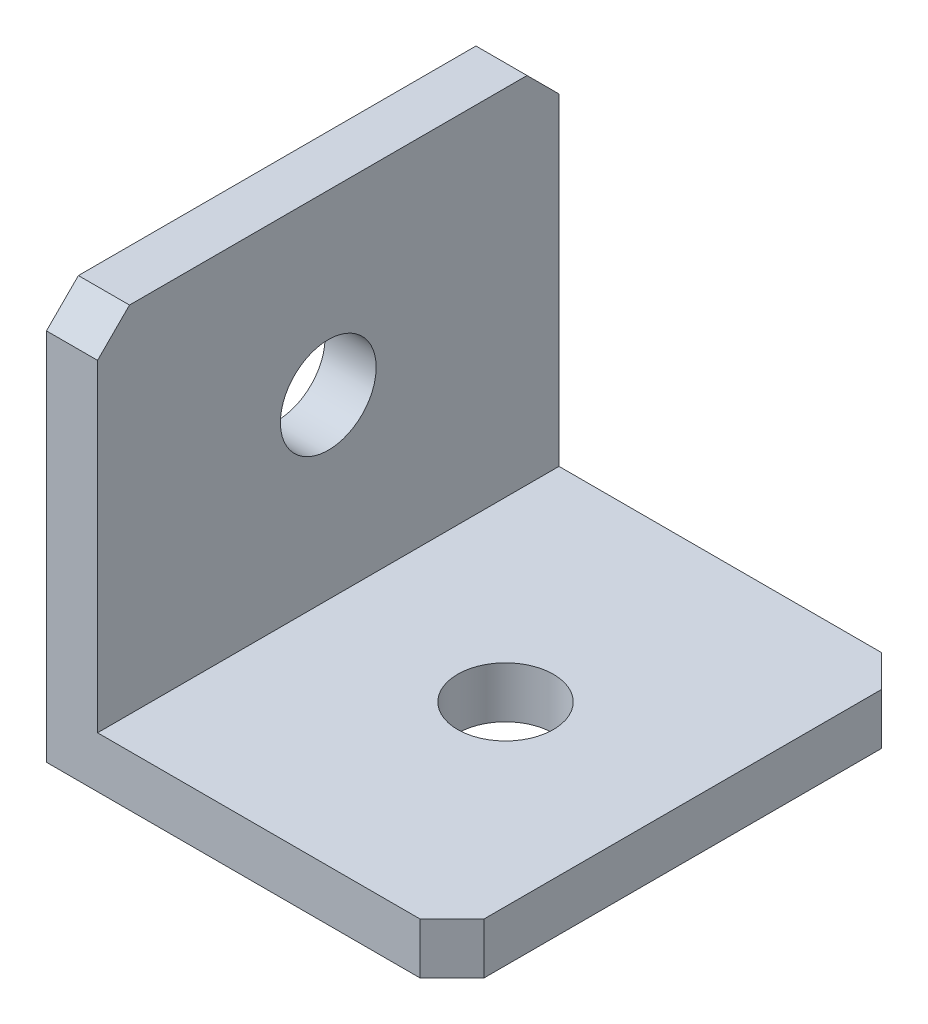
ISO-10303-21;
HEADER;
FILE_DESCRIPTION(('STEP AP214'),'2;1');
FILE_NAME('part.step','',(''),(''),'','','');
FILE_SCHEMA(('AUTOMOTIVE_DESIGN { 1 0 10303 214 1 1 1 1 }'));
ENDSEC;
DATA;
#1=APPLICATION_CONTEXT('core data for automotive mechanical design processes');
#2=APPLICATION_PROTOCOL_DEFINITION('international standard','automotive_design',2000,#1);
#3=PRODUCT_CONTEXT('',#1,'mechanical');
#4=PRODUCT('Part','Part','',(#3));
#5=PRODUCT_RELATED_PRODUCT_CATEGORY('part','',(#4));
#6=PRODUCT_DEFINITION_FORMATION('','',#4);
#7=PRODUCT_DEFINITION_CONTEXT('part definition',#1,'design');
#8=PRODUCT_DEFINITION('design','',#6,#7);
#9=PRODUCT_DEFINITION_SHAPE('','',#8);
#10=(LENGTH_UNIT() NAMED_UNIT(*) SI_UNIT(.MILLI.,.METRE.));
#11=(NAMED_UNIT(*) PLANE_ANGLE_UNIT() SI_UNIT($,.RADIAN.));
#12=(NAMED_UNIT(*) SI_UNIT($,.STERADIAN.) SOLID_ANGLE_UNIT());
#13=UNCERTAINTY_MEASURE_WITH_UNIT(LENGTH_MEASURE(1.E-05),#10,'distance_accuracy_value','');
#14=(GEOMETRIC_REPRESENTATION_CONTEXT(3) GLOBAL_UNCERTAINTY_ASSIGNED_CONTEXT((#13)) GLOBAL_UNIT_ASSIGNED_CONTEXT((#10,
#11,#12)) REPRESENTATION_CONTEXT('',''));
#15=CARTESIAN_POINT('',(0.,0.,0.));
#16=DIRECTION('',(0.,0.,1.));
#17=DIRECTION('',(1.,0.,0.));
#18=AXIS2_PLACEMENT_3D('',#15,#16,#17);
#19=CARTESIAN_POINT('',(22.2,0.,28.9));
#20=DIRECTION('',(0.,-1.,0.));
#21=DIRECTION('',(1.,0.,0.));
#22=AXIS2_PLACEMENT_3D('',#19,#20,#21);
#23=PLANE('',#22);
#24=CARTESIAN_POINT('',(11.1,0.,14.45));
#25=DIRECTION('',(0.,1.,0.));
#26=DIRECTION('',(-1.,0.,0.));
#27=AXIS2_PLACEMENT_3D('',#24,#25,#26);
#28=CIRCLE('',#27,3.);
#29=CARTESIAN_POINT('',(8.1,0.,14.45));
#30=VERTEX_POINT('',#29);
#31=EDGE_CURVE('E310',#30,#30,#28,.T.);
#32=ORIENTED_EDGE('',*,*,#31,.F.);
#33=EDGE_LOOP('',(#32));
#34=FACE_BOUND('',#33,.T.);
#35=DIRECTION('',(0.,0.,-1.));
#36=VECTOR('',#35,1.);
#37=CARTESIAN_POINT('',(22.2,0.,28.9));
#38=LINE('',#37,#36);
#39=CARTESIAN_POINT('',(22.2,0.,26.9));
#40=VERTEX_POINT('',#39);
#41=CARTESIAN_POINT('',(22.2,0.,1.99999999999999));
#42=VERTEX_POINT('',#41);
#43=EDGE_CURVE('E214',#40,#42,#38,.T.);
#44=ORIENTED_EDGE('',*,*,#43,.T.);
#45=DIRECTION('',(-0.70710678118655,0.,-0.707106781186545));
#46=VECTOR('',#45,1.);
#47=CARTESIAN_POINT('',(22.2,0.,1.99999999999999));
#48=LINE('',#47,#46);
#49=CARTESIAN_POINT('',(20.2,0.,0.));
#50=VERTEX_POINT('',#49);
#51=EDGE_CURVE('E201',#42,#50,#48,.T.);
#52=ORIENTED_EDGE('',*,*,#51,.T.);
#53=DIRECTION('',(-1.,0.,0.));
#54=VECTOR('',#53,1.);
#55=CARTESIAN_POINT('',(22.2,0.,0.));
#56=LINE('',#55,#54);
#57=CARTESIAN_POINT('',(0.,0.,0.));
#58=VERTEX_POINT('',#57);
#59=EDGE_CURVE('E152',#50,#58,#56,.T.);
#60=ORIENTED_EDGE('',*,*,#59,.T.);
#61=DIRECTION('',(0.,0.,-1.));
#62=VECTOR('',#61,1.);
#63=CARTESIAN_POINT('',(0.,0.,28.9));
#64=LINE('',#63,#62);
#65=CARTESIAN_POINT('',(0.,0.,28.9));
#66=VERTEX_POINT('',#65);
#67=EDGE_CURVE('E143',#66,#58,#64,.T.);
#68=ORIENTED_EDGE('',*,*,#67,.F.);
#69=DIRECTION('',(-1.,0.,0.));
#70=VECTOR('',#69,1.);
#71=CARTESIAN_POINT('',(22.2,0.,28.9));
#72=LINE('',#71,#70);
#73=CARTESIAN_POINT('',(20.2,0.,28.9));
#74=VERTEX_POINT('',#73);
#75=EDGE_CURVE('E125',#74,#66,#72,.T.);
#76=ORIENTED_EDGE('',*,*,#75,.F.);
#77=DIRECTION('',(-0.707106781186546,0.,0.707106781186549));
#78=VECTOR('',#77,1.);
#79=CARTESIAN_POINT('',(20.2,0.,28.9));
#80=LINE('',#79,#78);
#81=EDGE_CURVE('E198',#74,#40,#80,.F.);
#82=ORIENTED_EDGE('',*,*,#81,.T.);
#83=EDGE_LOOP('',(#44,#52,#60,#68,#76,#82));
#84=FACE_BOUND('',#83,.T.);
#85=ADVANCED_FACE('F45',(#34,#84),#23,.F.);
#86=CARTESIAN_POINT('',(0.,0.,28.9));
#87=DIRECTION('',(-1.,0.,0.));
#88=DIRECTION('',(0.,-1.,0.));
#89=AXIS2_PLACEMENT_3D('',#86,#87,#88);
#90=PLANE('',#89);
#91=CARTESIAN_POINT('',(0.,11.1,14.45));
#92=DIRECTION('',(1.,0.,0.));
#93=DIRECTION('',(0.,1.,0.));
#94=AXIS2_PLACEMENT_3D('',#91,#92,#93);
#95=CIRCLE('',#94,3.);
#96=CARTESIAN_POINT('',(0.,14.1,14.45));
#97=VERTEX_POINT('',#96);
#98=EDGE_CURVE('E306',#97,#97,#95,.T.);
#99=ORIENTED_EDGE('',*,*,#98,.F.);
#100=EDGE_LOOP('',(#99));
#101=FACE_BOUND('',#100,.T.);
#102=DIRECTION('',(0.,1.,0.));
#103=VECTOR('',#102,1.);
#104=CARTESIAN_POINT('',(0.,0.,0.));
#105=LINE('',#104,#103);
#106=CARTESIAN_POINT('',(0.,20.2,0.));
#107=VERTEX_POINT('',#106);
#108=EDGE_CURVE('E244',#58,#107,#105,.T.);
#109=ORIENTED_EDGE('',*,*,#108,.T.);
#110=DIRECTION('',(0.,0.70710678118655,0.707106781186545));
#111=VECTOR('',#110,1.);
#112=CARTESIAN_POINT('',(0.,22.2,1.99999999999999));
#113=LINE('',#112,#111);
#114=CARTESIAN_POINT('',(0.,22.2,1.99999999999999));
#115=VERTEX_POINT('',#114);
#116=EDGE_CURVE('E184',#107,#115,#113,.T.);
#117=ORIENTED_EDGE('',*,*,#116,.T.);
#118=DIRECTION('',(0.,0.,-1.));
#119=VECTOR('',#118,1.);
#120=CARTESIAN_POINT('',(0.,22.2,28.9));
#121=LINE('',#120,#119);
#122=CARTESIAN_POINT('',(0.,22.2,26.9));
#123=VERTEX_POINT('',#122);
#124=EDGE_CURVE('E156',#123,#115,#121,.T.);
#125=ORIENTED_EDGE('',*,*,#124,.F.);
#126=DIRECTION('',(0.,0.707106781186546,-0.707106781186549));
#127=VECTOR('',#126,1.);
#128=CARTESIAN_POINT('',(0.,20.2,28.9));
#129=LINE('',#128,#127);
#130=CARTESIAN_POINT('',(0.,20.2,28.9));
#131=VERTEX_POINT('',#130);
#132=EDGE_CURVE('E146',#123,#131,#129,.F.);
#133=ORIENTED_EDGE('',*,*,#132,.T.);
#134=DIRECTION('',(0.,1.,0.));
#135=VECTOR('',#134,1.);
#136=CARTESIAN_POINT('',(0.,0.,28.9));
#137=LINE('',#136,#135);
#138=EDGE_CURVE('E129',#66,#131,#137,.T.);
#139=ORIENTED_EDGE('',*,*,#138,.F.);
#140=ORIENTED_EDGE('',*,*,#67,.T.);
#141=EDGE_LOOP('',(#109,#117,#125,#133,#139,#140));
#142=FACE_BOUND('',#141,.T.);
#143=ADVANCED_FACE('F142',(#101,#142),#90,.F.);
#144=CARTESIAN_POINT('',(0.,22.2,28.9));
#145=DIRECTION('',(0.,-1.,0.));
#146=DIRECTION('',(0.,0.,-1.));
#147=AXIS2_PLACEMENT_3D('',#144,#145,#146);
#148=PLANE('',#147);
#149=ORIENTED_EDGE('',*,*,#124,.T.);
#150=DIRECTION('',(-1.,0.,0.));
#151=VECTOR('',#150,1.);
#152=CARTESIAN_POINT('',(-3.2,22.2,1.99999999999999));
#153=LINE('',#152,#151);
#154=CARTESIAN_POINT('',(-3.2,22.2,1.99999999999999));
#155=VERTEX_POINT('',#154);
#156=EDGE_CURVE('E160',#115,#155,#153,.T.);
#157=ORIENTED_EDGE('',*,*,#156,.T.);
#158=DIRECTION('',(0.,0.,-1.));
#159=VECTOR('',#158,1.);
#160=CARTESIAN_POINT('',(-3.2,22.2,28.9));
#161=LINE('',#160,#159);
#162=CARTESIAN_POINT('',(-3.2,22.2,26.9));
#163=VERTEX_POINT('',#162);
#164=EDGE_CURVE('E163',#163,#155,#161,.T.);
#165=ORIENTED_EDGE('',*,*,#164,.F.);
#166=DIRECTION('',(1.,0.,0.));
#167=VECTOR('',#166,1.);
#168=CARTESIAN_POINT('',(0.,22.2,26.9));
#169=LINE('',#168,#167);
#170=EDGE_CURVE('E155',#163,#123,#169,.T.);
#171=ORIENTED_EDGE('',*,*,#170,.T.);
#172=EDGE_LOOP('',(#149,#157,#165,#171));
#173=FACE_BOUND('',#172,.T.);
#174=ADVANCED_FACE('F235',(#173),#148,.F.);
#175=CARTESIAN_POINT('',(-3.2,22.2,28.9));
#176=DIRECTION('',(1.,0.,0.));
#177=DIRECTION('',(0.,1.,0.));
#178=AXIS2_PLACEMENT_3D('',#175,#176,#177);
#179=PLANE('',#178);
#180=CARTESIAN_POINT('',(-3.2,11.1,14.45));
#181=DIRECTION('',(1.,0.,0.));
#182=DIRECTION('',(0.,1.,0.));
#183=AXIS2_PLACEMENT_3D('',#180,#181,#182);
#184=CIRCLE('',#183,3.);
#185=CARTESIAN_POINT('',(-3.2,14.1,14.45));
#186=VERTEX_POINT('',#185);
#187=EDGE_CURVE('E303',#186,#186,#184,.T.);
#188=ORIENTED_EDGE('',*,*,#187,.T.);
#189=EDGE_LOOP('',(#188));
#190=FACE_BOUND('',#189,.T.);
#191=ORIENTED_EDGE('',*,*,#164,.T.);
#192=DIRECTION('',(0.,-0.70710678118655,-0.707106781186545));
#193=VECTOR('',#192,1.);
#194=CARTESIAN_POINT('',(-3.2,22.2,1.99999999999999));
#195=LINE('',#194,#193);
#196=CARTESIAN_POINT('',(-3.2,20.2,0.));
#197=VERTEX_POINT('',#196);
#198=EDGE_CURVE('E173',#155,#197,#195,.T.);
#199=ORIENTED_EDGE('',*,*,#198,.T.);
#200=DIRECTION('',(0.,-1.,0.));
#201=VECTOR('',#200,1.);
#202=CARTESIAN_POINT('',(-3.2,22.2,0.));
#203=LINE('',#202,#201);
#204=CARTESIAN_POINT('',(-3.2,-3.2,0.));
#205=VERTEX_POINT('',#204);
#206=EDGE_CURVE('E247',#197,#205,#203,.T.);
#207=ORIENTED_EDGE('',*,*,#206,.T.);
#208=DIRECTION('',(0.,0.,-1.));
#209=VECTOR('',#208,1.);
#210=CARTESIAN_POINT('',(-3.2,-3.2,28.9));
#211=LINE('',#210,#209);
#212=CARTESIAN_POINT('',(-3.2,-3.2,28.9));
#213=VERTEX_POINT('',#212);
#214=EDGE_CURVE('E221',#213,#205,#211,.T.);
#215=ORIENTED_EDGE('',*,*,#214,.F.);
#216=DIRECTION('',(0.,-1.,0.));
#217=VECTOR('',#216,1.);
#218=CARTESIAN_POINT('',(-3.2,22.2,28.9));
#219=LINE('',#218,#217);
#220=CARTESIAN_POINT('',(-3.2,20.2,28.9));
#221=VERTEX_POINT('',#220);
#222=EDGE_CURVE('E148',#221,#213,#219,.T.);
#223=ORIENTED_EDGE('',*,*,#222,.F.);
#224=DIRECTION('',(0.,-0.707106781186546,0.707106781186549));
#225=VECTOR('',#224,1.);
#226=CARTESIAN_POINT('',(-3.2,20.2,28.9));
#227=LINE('',#226,#225);
#228=EDGE_CURVE('E170',#221,#163,#227,.F.);
#229=ORIENTED_EDGE('',*,*,#228,.T.);
#230=EDGE_LOOP('',(#191,#199,#207,#215,#223,#229));
#231=FACE_BOUND('',#230,.T.);
#232=ADVANCED_FACE('F231',(#190,#231),#179,.F.);
#233=CARTESIAN_POINT('',(-3.2,-3.2,28.9));
#234=DIRECTION('',(0.,1.,0.));
#235=DIRECTION('',(-1.,0.,0.));
#236=AXIS2_PLACEMENT_3D('',#233,#234,#235);
#237=PLANE('',#236);
#238=CARTESIAN_POINT('',(11.1,-3.2,14.45));
#239=DIRECTION('',(0.,1.,0.));
#240=DIRECTION('',(-1.,0.,0.));
#241=AXIS2_PLACEMENT_3D('',#238,#239,#240);
#242=CIRCLE('',#241,3.);
#243=CARTESIAN_POINT('',(8.1,-3.2,14.45));
#244=VERTEX_POINT('',#243);
#245=EDGE_CURVE('E245',#244,#244,#242,.T.);
#246=ORIENTED_EDGE('',*,*,#245,.T.);
#247=EDGE_LOOP('',(#246));
#248=FACE_BOUND('',#247,.T.);
#249=DIRECTION('',(1.,0.,0.));
#250=VECTOR('',#249,1.);
#251=CARTESIAN_POINT('',(-3.2,-3.2,0.));
#252=LINE('',#251,#250);
#253=CARTESIAN_POINT('',(20.2,-3.2,0.));
#254=VERTEX_POINT('',#253);
#255=EDGE_CURVE('E137',#205,#254,#252,.T.);
#256=ORIENTED_EDGE('',*,*,#255,.T.);
#257=DIRECTION('',(0.70710678118655,0.,0.707106781186545));
#258=VECTOR('',#257,1.);
#259=CARTESIAN_POINT('',(22.2,-3.2,1.99999999999999));
#260=LINE('',#259,#258);
#261=CARTESIAN_POINT('',(22.2,-3.2,1.99999999999999));
#262=VERTEX_POINT('',#261);
#263=EDGE_CURVE('E11',#254,#262,#260,.T.);
#264=ORIENTED_EDGE('',*,*,#263,.T.);
#265=DIRECTION('',(0.,0.,-1.));
#266=VECTOR('',#265,1.);
#267=CARTESIAN_POINT('',(22.2,-3.2,28.9));
#268=LINE('',#267,#266);
#269=CARTESIAN_POINT('',(22.2,-3.2,26.9));
#270=VERTEX_POINT('',#269);
#271=EDGE_CURVE('E209',#270,#262,#268,.T.);
#272=ORIENTED_EDGE('',*,*,#271,.F.);
#273=DIRECTION('',(0.707106781186546,0.,-0.707106781186549));
#274=VECTOR('',#273,1.);
#275=CARTESIAN_POINT('',(20.2,-3.2,28.9));
#276=LINE('',#275,#274);
#277=CARTESIAN_POINT('',(20.2,-3.2,28.9));
#278=VERTEX_POINT('',#277);
#279=EDGE_CURVE('E55',#270,#278,#276,.F.);
#280=ORIENTED_EDGE('',*,*,#279,.T.);
#281=DIRECTION('',(1.,0.,0.));
#282=VECTOR('',#281,1.);
#283=CARTESIAN_POINT('',(-3.2,-3.2,28.9));
#284=LINE('',#283,#282);
#285=EDGE_CURVE('E208',#213,#278,#284,.T.);
#286=ORIENTED_EDGE('',*,*,#285,.F.);
#287=ORIENTED_EDGE('',*,*,#214,.T.);
#288=EDGE_LOOP('',(#256,#264,#272,#280,#286,#287));
#289=FACE_BOUND('',#288,.T.);
#290=ADVANCED_FACE('F206',(#248,#289),#237,.F.);
#291=CARTESIAN_POINT('',(22.2,-3.2,28.9));
#292=DIRECTION('',(-1.,0.,0.));
#293=DIRECTION('',(0.,0.,1.));
#294=AXIS2_PLACEMENT_3D('',#291,#292,#293);
#295=PLANE('',#294);
#296=ORIENTED_EDGE('',*,*,#271,.T.);
#297=DIRECTION('',(0.,1.,0.));
#298=VECTOR('',#297,1.);
#299=CARTESIAN_POINT('',(22.2,0.,1.99999999999999));
#300=LINE('',#299,#298);
#301=EDGE_CURVE('E194',#262,#42,#300,.T.);
#302=ORIENTED_EDGE('',*,*,#301,.T.);
#303=ORIENTED_EDGE('',*,*,#43,.F.);
#304=DIRECTION('',(0.,-1.,0.));
#305=VECTOR('',#304,1.);
#306=CARTESIAN_POINT('',(22.2,-3.2,26.9));
#307=LINE('',#306,#305);
#308=EDGE_CURVE('E67',#40,#270,#307,.T.);
#309=ORIENTED_EDGE('',*,*,#308,.T.);
#310=EDGE_LOOP('',(#296,#302,#303,#309));
#311=FACE_BOUND('',#310,.T.);
#312=ADVANCED_FACE('F216',(#311),#295,.F.);
#313=CARTESIAN_POINT('',(0.,0.,28.9));
#314=DIRECTION('',(0.,0.,-1.));
#315=DIRECTION('',(-1.,0.,0.));
#316=AXIS2_PLACEMENT_3D('',#313,#314,#315);
#317=PLANE('',#316);
#318=ORIENTED_EDGE('',*,*,#138,.T.);
#319=DIRECTION('',(-1.,0.,0.));
#320=VECTOR('',#319,1.);
#321=CARTESIAN_POINT('',(0.,20.2,28.9));
#322=LINE('',#321,#320);
#323=EDGE_CURVE('E189',#131,#221,#322,.T.);
#324=ORIENTED_EDGE('',*,*,#323,.T.);
#325=ORIENTED_EDGE('',*,*,#222,.T.);
#326=ORIENTED_EDGE('',*,*,#285,.T.);
#327=DIRECTION('',(0.,1.,0.));
#328=VECTOR('',#327,1.);
#329=CARTESIAN_POINT('',(20.2,0.,28.9));
#330=LINE('',#329,#328);
#331=EDGE_CURVE('E133',#278,#74,#330,.T.);
#332=ORIENTED_EDGE('',*,*,#331,.T.);
#333=ORIENTED_EDGE('',*,*,#75,.T.);
#334=EDGE_LOOP('',(#318,#324,#325,#326,#332,#333));
#335=FACE_BOUND('',#334,.T.);
#336=ADVANCED_FACE('F127',(#335),#317,.F.);
#337=CARTESIAN_POINT('',(0.,0.,0.));
#338=DIRECTION('',(0.,0.,-1.));
#339=DIRECTION('',(-1.,0.,0.));
#340=AXIS2_PLACEMENT_3D('',#337,#338,#339);
#341=PLANE('',#340);
#342=ORIENTED_EDGE('',*,*,#206,.F.);
#343=DIRECTION('',(1.,0.,0.));
#344=VECTOR('',#343,1.);
#345=CARTESIAN_POINT('',(0.,20.2,0.));
#346=LINE('',#345,#344);
#347=EDGE_CURVE('E179',#197,#107,#346,.T.);
#348=ORIENTED_EDGE('',*,*,#347,.T.);
#349=ORIENTED_EDGE('',*,*,#108,.F.);
#350=ORIENTED_EDGE('',*,*,#59,.F.);
#351=DIRECTION('',(0.,-1.,0.));
#352=VECTOR('',#351,1.);
#353=CARTESIAN_POINT('',(20.2,-3.2,0.));
#354=LINE('',#353,#352);
#355=EDGE_CURVE('E176',#50,#254,#354,.T.);
#356=ORIENTED_EDGE('',*,*,#355,.T.);
#357=ORIENTED_EDGE('',*,*,#255,.F.);
#358=EDGE_LOOP('',(#342,#348,#349,#350,#356,#357));
#359=FACE_BOUND('',#358,.T.);
#360=ADVANCED_FACE('F255',(#359),#341,.T.);
#361=CARTESIAN_POINT('',(0.,22.2,1.99999999999999));
#362=DIRECTION('',(0.,0.707106781186545,-0.70710678118655));
#363=DIRECTION('',(1.,0.,0.));
#364=AXIS2_PLACEMENT_3D('',#361,#362,#363);
#365=PLANE('',#364);
#366=ORIENTED_EDGE('',*,*,#116,.F.);
#367=ORIENTED_EDGE('',*,*,#347,.F.);
#368=ORIENTED_EDGE('',*,*,#198,.F.);
#369=ORIENTED_EDGE('',*,*,#156,.F.);
#370=EDGE_LOOP('',(#366,#367,#368,#369));
#371=FACE_BOUND('',#370,.T.);
#372=ADVANCED_FACE('F259',(#371),#365,.T.);
#373=CARTESIAN_POINT('',(0.,20.2,28.9));
#374=DIRECTION('',(0.,-0.707106781186549,-0.707106781186546));
#375=DIRECTION('',(-1.,0.,0.));
#376=AXIS2_PLACEMENT_3D('',#373,#374,#375);
#377=PLANE('',#376);
#378=ORIENTED_EDGE('',*,*,#132,.F.);
#379=ORIENTED_EDGE('',*,*,#170,.F.);
#380=ORIENTED_EDGE('',*,*,#228,.F.);
#381=ORIENTED_EDGE('',*,*,#323,.F.);
#382=EDGE_LOOP('',(#378,#379,#380,#381));
#383=FACE_BOUND('',#382,.T.);
#384=ADVANCED_FACE('F238',(#383),#377,.F.);
#385=CARTESIAN_POINT('',(22.2,-3.2,1.99999999999999));
#386=DIRECTION('',(0.707106781186545,0.,-0.70710678118655));
#387=DIRECTION('',(0.,-1.,0.));
#388=AXIS2_PLACEMENT_3D('',#385,#386,#387);
#389=PLANE('',#388);
#390=ORIENTED_EDGE('',*,*,#263,.F.);
#391=ORIENTED_EDGE('',*,*,#355,.F.);
#392=ORIENTED_EDGE('',*,*,#51,.F.);
#393=ORIENTED_EDGE('',*,*,#301,.F.);
#394=EDGE_LOOP('',(#390,#391,#392,#393));
#395=FACE_BOUND('',#394,.T.);
#396=ADVANCED_FACE('F254',(#395),#389,.T.);
#397=CARTESIAN_POINT('',(20.2,0.,28.9));
#398=DIRECTION('',(-0.707106781186549,0.,-0.707106781186546));
#399=DIRECTION('',(0.,1.,0.));
#400=AXIS2_PLACEMENT_3D('',#397,#398,#399);
#401=PLANE('',#400);
#402=ORIENTED_EDGE('',*,*,#279,.F.);
#403=ORIENTED_EDGE('',*,*,#308,.F.);
#404=ORIENTED_EDGE('',*,*,#81,.F.);
#405=ORIENTED_EDGE('',*,*,#331,.F.);
#406=EDGE_LOOP('',(#402,#403,#404,#405));
#407=FACE_BOUND('',#406,.T.);
#408=ADVANCED_FACE('F48',(#407),#401,.F.);
#409=CARTESIAN_POINT('',(11.1,-3.2,14.45));
#410=DIRECTION('',(0.,1.,0.));
#411=DIRECTION('',(-1.,0.,0.));
#412=AXIS2_PLACEMENT_3D('',#409,#410,#411);
#413=CYLINDRICAL_SURFACE('',#412,3.);
#414=ORIENTED_EDGE('',*,*,#245,.F.);
#415=EDGE_LOOP('',(#414));
#416=FACE_BOUND('',#415,.T.);
#417=ORIENTED_EDGE('',*,*,#31,.T.);
#418=EDGE_LOOP('',(#417));
#419=FACE_BOUND('',#418,.T.);
#420=ADVANCED_FACE('F291',(#416,#419),#413,.F.);
#421=CARTESIAN_POINT('',(-3.2,11.1,14.45));
#422=DIRECTION('',(1.,0.,0.));
#423=DIRECTION('',(0.,1.,0.));
#424=AXIS2_PLACEMENT_3D('',#421,#422,#423);
#425=CYLINDRICAL_SURFACE('',#424,3.);
#426=ORIENTED_EDGE('',*,*,#187,.F.);
#427=EDGE_LOOP('',(#426));
#428=FACE_BOUND('',#427,.T.);
#429=ORIENTED_EDGE('',*,*,#98,.T.);
#430=EDGE_LOOP('',(#429));
#431=FACE_BOUND('',#430,.T.);
#432=ADVANCED_FACE('F294',(#428,#431),#425,.F.);
#433=CLOSED_SHELL('',(#85,#143,#174,#232,#290,#312,#336,#360,#372,#384,#396,#408,#420,#432));
#434=MANIFOLD_SOLID_BREP('B2',#433);
#435=ADVANCED_BREP_SHAPE_REPRESENTATION('',(#18,#434),#14);
#436=SHAPE_DEFINITION_REPRESENTATION(#9,#435);
ENDSEC;
END-ISO-10303-21;
